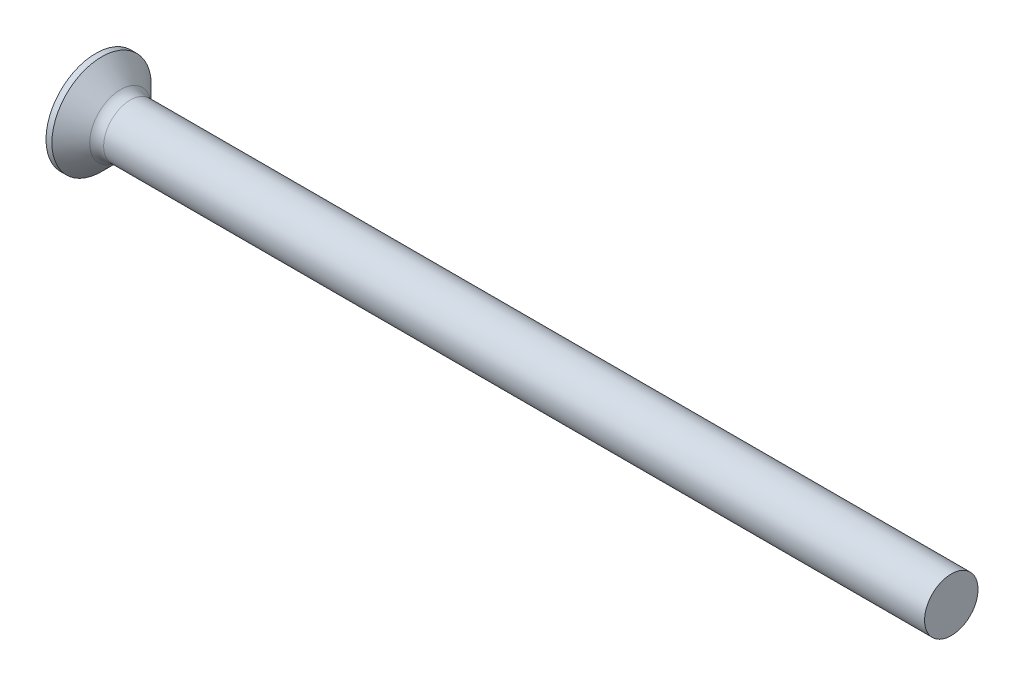
ISO-10303-21;
HEADER;
FILE_DESCRIPTION(('STEP AP214'),'2;1');
FILE_NAME('part.step','',(''),(''),'','','');
FILE_SCHEMA(('AUTOMOTIVE_DESIGN { 1 0 10303 214 1 1 1 1 }'));
ENDSEC;
DATA;
#1=APPLICATION_CONTEXT('core data for automotive mechanical design processes');
#2=APPLICATION_PROTOCOL_DEFINITION('international standard','automotive_design',2000,#1);
#3=PRODUCT_CONTEXT('',#1,'mechanical');
#4=PRODUCT('Part','Part','',(#3));
#5=PRODUCT_RELATED_PRODUCT_CATEGORY('part','',(#4));
#6=PRODUCT_DEFINITION_FORMATION('','',#4);
#7=PRODUCT_DEFINITION_CONTEXT('part definition',#1,'design');
#8=PRODUCT_DEFINITION('design','',#6,#7);
#9=PRODUCT_DEFINITION_SHAPE('','',#8);
#10=(LENGTH_UNIT() NAMED_UNIT(*) SI_UNIT(.MILLI.,.METRE.));
#11=(NAMED_UNIT(*) PLANE_ANGLE_UNIT() SI_UNIT($,.RADIAN.));
#12=(NAMED_UNIT(*) SI_UNIT($,.STERADIAN.) SOLID_ANGLE_UNIT());
#13=UNCERTAINTY_MEASURE_WITH_UNIT(LENGTH_MEASURE(1.E-05),#10,'distance_accuracy_value','');
#14=(GEOMETRIC_REPRESENTATION_CONTEXT(3) GLOBAL_UNCERTAINTY_ASSIGNED_CONTEXT((#13)) GLOBAL_UNIT_ASSIGNED_CONTEXT((#10,
#11,#12)) REPRESENTATION_CONTEXT('',''));
#15=CARTESIAN_POINT('',(0.,0.,0.));
#16=DIRECTION('',(0.,0.,1.));
#17=DIRECTION('',(1.,0.,0.));
#18=AXIS2_PLACEMENT_3D('',#15,#16,#17);
#19=CARTESIAN_POINT('',(3.05,-0.929326349741566,0.515));
#20=DIRECTION('',(0.,0.,-1.));
#21=DIRECTION('',(0.,1.,0.));
#22=AXIS2_PLACEMENT_3D('',#19,#20,#21);
#23=PLANE('',#22);
#24=DIRECTION('',(0.,-1.,0.));
#25=VECTOR('',#24,1.);
#26=CARTESIAN_POINT('',(0.,2.45,0.515));
#27=LINE('',#26,#25);
#28=CARTESIAN_POINT('',(0.,-0.931375357653026,0.515));
#29=VERTEX_POINT('',#28);
#30=CARTESIAN_POINT('',(0.,-2.45,0.515));
#31=VERTEX_POINT('',#30);
#32=EDGE_CURVE('E305',#29,#31,#27,.T.);
#33=ORIENTED_EDGE('',*,*,#32,.F.);
#34=CARTESIAN_POINT('',(-1.54221347305349,-1.05291860734043,0.515));
#35=CARTESIAN_POINT('',(-1.22007147016316,-1.02783607001973,0.515));
#36=CARTESIAN_POINT('',(-0.89794181675164,-1.002592893973,0.515));
#37=CARTESIAN_POINT('',(-0.253713842852045,-0.951673528807875,0.515));
#38=CARTESIAN_POINT('',(0.0683844773279263,-0.925997335794192,0.515));
#39=CARTESIAN_POINT('',(0.712537341146251,-0.874100649412191,0.515));
#40=CARTESIAN_POINT('',(1.03459188478602,-0.847880156061489,0.515));
#41=CARTESIAN_POINT('',(1.67864013954242,-0.794723210967585,0.515));
#42=CARTESIAN_POINT('',(2.0006338510091,-0.767786763479055,0.515));
#43=CARTESIAN_POINT('',(2.56056239677504,-0.720091607539808,0.515));
#44=CARTESIAN_POINT('',(2.7985160340986,-0.699554136185312,0.515));
#45=CARTESIAN_POINT('',(3.27436149939217,-0.657782810112313,0.515));
#46=CARTESIAN_POINT('',(3.51225332755344,-0.636548957574876,0.515));
#47=CARTESIAN_POINT('',(3.98796007755392,-0.59316517097504,0.515));
#48=CARTESIAN_POINT('',(4.22577499737104,-0.571015214531953,0.515));
#49=CARTESIAN_POINT('',(4.70127802763926,-0.525368927832394,0.515));
#50=CARTESIAN_POINT('',(4.93896613655203,-0.50187258160175,0.515000000000001));
#51=CARTESIAN_POINT('',(5.17656597464715,-0.477487906778811,0.515));
#52=B_SPLINE_CURVE_WITH_KNOTS('',3,(#34,#35,#36,#37,#38,#39,#40,#41,#42,#43,#44,#45,#46,#47,#48,
#49,#50,#51),.UNSPECIFIED.,.F.,.F.,(4,2,2,2,2,2,2,2,4),(0.,0.9693512359483,1.9387111965537,
2.90807112578744,3.87742529573196,4.59393929763426,5.3104510556289,6.0269803285681,
6.74351810449256),.UNSPECIFIED.);
#53=CARTESIAN_POINT('',(3.05,-0.677477674908921,0.515));
#54=VERTEX_POINT('',#53);
#55=EDGE_CURVE('E191',#29,#54,#52,.T.);
#56=ORIENTED_EDGE('',*,*,#55,.T.);
#57=DIRECTION('',(0.,-1.,0.));
#58=VECTOR('',#57,1.);
#59=CARTESIAN_POINT('',(3.05,0.929326349741566,0.515));
#60=LINE('',#59,#58);
#61=CARTESIAN_POINT('',(3.05,-0.929326349741566,0.515));
#62=VERTEX_POINT('',#61);
#63=EDGE_CURVE('E329',#54,#62,#60,.T.);
#64=ORIENTED_EDGE('',*,*,#63,.T.);
#65=DIRECTION('',(0.894934391398443,0.446197753347436,0.));
#66=VECTOR('',#65,1.);
#67=CARTESIAN_POINT('',(0.,-2.45,0.515));
#68=LINE('',#67,#66);
#69=EDGE_CURVE('E316',#31,#62,#68,.T.);
#70=ORIENTED_EDGE('',*,*,#69,.F.);
#71=EDGE_LOOP('',(#33,#56,#64,#70));
#72=FACE_BOUND('',#71,.T.);
#73=ADVANCED_FACE('F35',(#72),#23,.T.);
#74=CARTESIAN_POINT('',(3.05,0.929326349741566,0.515));
#75=VERTEX_POINT('',#74);
#76=CARTESIAN_POINT('',(3.05,0.677477674908922,0.515));
#77=VERTEX_POINT('',#76);
#78=EDGE_CURVE('E331',#75,#77,#60,.T.);
#79=ORIENTED_EDGE('',*,*,#78,.T.);
#80=CARTESIAN_POINT('',(-1.54221347305349,1.05291860734043,0.515));
#81=CARTESIAN_POINT('',(-1.22007147016316,1.02783607001973,0.515));
#82=CARTESIAN_POINT('',(-0.897941816751639,1.002592893973,0.515));
#83=CARTESIAN_POINT('',(-0.253713842852044,0.951673528807875,0.515));
#84=CARTESIAN_POINT('',(0.0683844773279269,0.925997335794192,0.515));
#85=CARTESIAN_POINT('',(0.712537341146252,0.874100649412191,0.515));
#86=CARTESIAN_POINT('',(1.03459188478602,0.847880156061489,0.515));
#87=CARTESIAN_POINT('',(1.67864013954242,0.794723210967585,0.515));
#88=CARTESIAN_POINT('',(2.0006338510091,0.767786763479056,0.515));
#89=CARTESIAN_POINT('',(2.56056239677504,0.720091607539808,0.515));
#90=CARTESIAN_POINT('',(2.7985160340986,0.699554136185312,0.515));
#91=CARTESIAN_POINT('',(3.27436149939217,0.657782810112313,0.515));
#92=CARTESIAN_POINT('',(3.51225332755343,0.636548957574876,0.515));
#93=CARTESIAN_POINT('',(3.98796007755392,0.59316517097504,0.515));
#94=CARTESIAN_POINT('',(4.22577499737104,0.571015214531953,0.515));
#95=CARTESIAN_POINT('',(4.70127802763926,0.525368927832394,0.515));
#96=CARTESIAN_POINT('',(4.93896613655203,0.50187258160175,0.515));
#97=CARTESIAN_POINT('',(5.17656597464715,0.477487906778811,0.515));
#98=B_SPLINE_CURVE_WITH_KNOTS('',3,(#80,#81,#82,#83,#84,#85,#86,#87,#88,#89,#90,#91,#92,#93,#94,
#95,#96,#97),.UNSPECIFIED.,.F.,.F.,(4,2,2,2,2,2,2,2,4),(0.,0.9693512359483,1.9387111965537,
2.90807112578744,3.87742529573196,4.59393929763426,5.3104510556289,6.0269803285681,
6.74351810449256),.UNSPECIFIED.);
#99=CARTESIAN_POINT('',(0.,0.931375357653026,0.515));
#100=VERTEX_POINT('',#99);
#101=EDGE_CURVE('E185',#77,#100,#98,.F.);
#102=ORIENTED_EDGE('',*,*,#101,.T.);
#103=CARTESIAN_POINT('',(0.,2.45,0.515));
#104=VERTEX_POINT('',#103);
#105=EDGE_CURVE('E307',#104,#100,#27,.T.);
#106=ORIENTED_EDGE('',*,*,#105,.F.);
#107=DIRECTION('',(0.894934391398443,-0.446197753347436,0.));
#108=VECTOR('',#107,1.);
#109=CARTESIAN_POINT('',(0.,2.45,0.515));
#110=LINE('',#109,#108);
#111=EDGE_CURVE('E63',#104,#75,#110,.T.);
#112=ORIENTED_EDGE('',*,*,#111,.T.);
#113=EDGE_LOOP('',(#79,#102,#106,#112));
#114=FACE_BOUND('',#113,.T.);
#115=ADVANCED_FACE('F167',(#114),#23,.T.);
#116=CARTESIAN_POINT('',(3.05,0.929326349741566,-0.515));
#117=DIRECTION('',(0.,0.,1.));
#118=DIRECTION('',(1.,0.,0.));
#119=AXIS2_PLACEMENT_3D('',#116,#117,#118);
#120=PLANE('',#119);
#121=DIRECTION('',(0.,1.,0.));
#122=VECTOR('',#121,1.);
#123=CARTESIAN_POINT('',(3.05,-0.929326349741566,-0.515));
#124=LINE('',#123,#122);
#125=CARTESIAN_POINT('',(3.05,-0.929326349741566,-0.515));
#126=VERTEX_POINT('',#125);
#127=CARTESIAN_POINT('',(3.05,-0.677477674908921,-0.515));
#128=VERTEX_POINT('',#127);
#129=EDGE_CURVE('E330',#126,#128,#124,.T.);
#130=ORIENTED_EDGE('',*,*,#129,.T.);
#131=CARTESIAN_POINT('',(-1.54221347058903,-1.05291860714859,-0.515));
#132=CARTESIAN_POINT('',(-1.22007146800241,-1.02783606985067,-0.515));
#133=CARTESIAN_POINT('',(-0.897941814894598,-1.00259289382691,-0.515));
#134=CARTESIAN_POINT('',(-0.253713841602368,-0.951673528708394,-0.515));
#135=CARTESIAN_POINT('',(0.0683844782739386,-0.925997335718344,-0.515));
#136=CARTESIAN_POINT('',(0.712537341258934,-0.874100649402746,-0.515));
#137=CARTESIAN_POINT('',(1.03459188436907,-0.847880156095195,-0.515));
#138=CARTESIAN_POINT('',(1.67864013806642,-0.794723211090118,-0.515));
#139=CARTESIAN_POINT('',(2.00063384900369,-0.767786763647265,-0.515));
#140=CARTESIAN_POINT('',(2.56056239424054,-0.720091607757628,-0.515));
#141=CARTESIAN_POINT('',(2.79851603156427,-0.699554136405274,-0.515));
#142=CARTESIAN_POINT('',(3.27436149685826,-0.657782810337244,-0.515));
#143=CARTESIAN_POINT('',(3.51225332501977,-0.636548957802634,-0.515));
#144=CARTESIAN_POINT('',(3.98796007502083,-0.593165171209448,-0.515));
#145=CARTESIAN_POINT('',(4.22577499483828,-0.571015214770186,-0.515));
#146=CARTESIAN_POINT('',(4.70127802510735,-0.525368928080088,-0.515));
#147=CARTESIAN_POINT('',(4.93896613402064,-0.501872581855082,-0.515));
#148=CARTESIAN_POINT('',(5.17656597211643,-0.477487907039094,-0.515));
#149=B_SPLINE_CURVE_WITH_KNOTS('',3,(#131,#132,#133,#134,#135,#136,#137,#138,#139,#140,#141,
#142,#143,#144,#145,#146,#147,#148),.UNSPECIFIED.,.F.,.F.,(4,2,2,2,2,2,2,2,4),(0.,
0.9693512350346,1.93871119472626,2.90807112236582,3.87742529071622,4.59393929261848,
5.3104510506131,6.02698032355223,6.74351809947659),.UNSPECIFIED.);
#150=CARTESIAN_POINT('',(0.,-0.931375357653026,-0.515));
#151=VERTEX_POINT('',#150);
#152=EDGE_CURVE('E232',#128,#151,#149,.F.);
#153=ORIENTED_EDGE('',*,*,#152,.T.);
#154=DIRECTION('',(0.,1.,0.));
#155=VECTOR('',#154,1.);
#156=CARTESIAN_POINT('',(0.,-2.45,-0.515));
#157=LINE('',#156,#155);
#158=CARTESIAN_POINT('',(0.,-2.45,-0.515));
#159=VERTEX_POINT('',#158);
#160=EDGE_CURVE('E306',#159,#151,#157,.T.);
#161=ORIENTED_EDGE('',*,*,#160,.F.);
#162=DIRECTION('',(0.894934391398443,0.446197753347436,0.));
#163=VECTOR('',#162,1.);
#164=CARTESIAN_POINT('',(0.,-2.45,-0.515));
#165=LINE('',#164,#163);
#166=EDGE_CURVE('E319',#159,#126,#165,.T.);
#167=ORIENTED_EDGE('',*,*,#166,.T.);
#168=EDGE_LOOP('',(#130,#153,#161,#167));
#169=FACE_BOUND('',#168,.T.);
#170=ADVANCED_FACE('F173',(#169),#120,.T.);
#171=CARTESIAN_POINT('',(0.,0.931375357653026,-0.515));
#172=VERTEX_POINT('',#171);
#173=CARTESIAN_POINT('',(0.,2.45,-0.515));
#174=VERTEX_POINT('',#173);
#175=EDGE_CURVE('E315',#172,#174,#157,.T.);
#176=ORIENTED_EDGE('',*,*,#175,.F.);
#177=CARTESIAN_POINT('',(-1.54221347058903,1.05291860714859,-0.515));
#178=CARTESIAN_POINT('',(-1.22007146800241,1.02783606985067,-0.515));
#179=CARTESIAN_POINT('',(-0.897941814894598,1.00259289382691,-0.515));
#180=CARTESIAN_POINT('',(-0.253713841602368,0.951673528708394,-0.515));
#181=CARTESIAN_POINT('',(0.0683844782739387,0.925997335718344,-0.515));
#182=CARTESIAN_POINT('',(0.712537341258934,0.874100649402746,-0.515));
#183=CARTESIAN_POINT('',(1.03459188436907,0.847880156095195,-0.515));
#184=CARTESIAN_POINT('',(1.67864013806642,0.794723211090118,-0.515));
#185=CARTESIAN_POINT('',(2.00063384900369,0.767786763647266,-0.515));
#186=CARTESIAN_POINT('',(2.56056239424054,0.720091607757628,-0.515));
#187=CARTESIAN_POINT('',(2.79851603156427,0.699554136405274,-0.515));
#188=CARTESIAN_POINT('',(3.27436149685826,0.657782810337244,-0.515));
#189=CARTESIAN_POINT('',(3.51225332501977,0.636548957802634,-0.515));
#190=CARTESIAN_POINT('',(3.98796007502083,0.593165171209449,-0.515));
#191=CARTESIAN_POINT('',(4.22577499483827,0.571015214770186,-0.515));
#192=CARTESIAN_POINT('',(4.70127802510734,0.525368928080088,-0.515));
#193=CARTESIAN_POINT('',(4.93896613402064,0.501872581855082,-0.515));
#194=CARTESIAN_POINT('',(5.17656597211643,0.477487907039094,-0.515));
#195=B_SPLINE_CURVE_WITH_KNOTS('',3,(#177,#178,#179,#180,#181,#182,#183,#184,#185,#186,#187,
#188,#189,#190,#191,#192,#193,#194),.UNSPECIFIED.,.F.,.F.,(4,2,2,2,2,2,2,2,4),(0.,
0.9693512350346,1.93871119472626,2.90807112236582,3.87742529071622,4.59393929261848,
5.3104510506131,6.02698032355223,6.74351809947659),.UNSPECIFIED.);
#196=CARTESIAN_POINT('',(3.05,0.677477674908921,-0.515));
#197=VERTEX_POINT('',#196);
#198=EDGE_CURVE('E228',#172,#197,#195,.T.);
#199=ORIENTED_EDGE('',*,*,#198,.T.);
#200=CARTESIAN_POINT('',(3.05,0.929326349741566,-0.515));
#201=VERTEX_POINT('',#200);
#202=EDGE_CURVE('E336',#197,#201,#124,.T.);
#203=ORIENTED_EDGE('',*,*,#202,.T.);
#204=DIRECTION('',(0.894934391398443,-0.446197753347436,0.));
#205=VECTOR('',#204,1.);
#206=CARTESIAN_POINT('',(0.,2.45,-0.515));
#207=LINE('',#206,#205);
#208=EDGE_CURVE('E323',#174,#201,#207,.T.);
#209=ORIENTED_EDGE('',*,*,#208,.F.);
#210=EDGE_LOOP('',(#176,#199,#203,#209));
#211=FACE_BOUND('',#210,.T.);
#212=ADVANCED_FACE('F452',(#211),#120,.T.);
#213=CARTESIAN_POINT('',(3.05,0.929326349741566,-0.515));
#214=DIRECTION('',(1.,0.,0.));
#215=DIRECTION('',(0.,0.,-1.));
#216=AXIS2_PLACEMENT_3D('',#213,#214,#215);
#217=PLANE('',#216);
#218=CARTESIAN_POINT('',(3.05,0.,0.));
#219=DIRECTION('',(-1.,0.,0.));
#220=DIRECTION('',(0.,0.,1.));
#221=AXIS2_PLACEMENT_3D('',#218,#219,#220);
#222=CIRCLE('',#221,0.850999999999999);
#223=EDGE_CURVE('E275',#128,#54,#222,.T.);
#224=ORIENTED_EDGE('',*,*,#223,.F.);
#225=ORIENTED_EDGE('',*,*,#129,.F.);
#226=DIRECTION('',(0.,0.,-1.));
#227=VECTOR('',#226,1.);
#228=CARTESIAN_POINT('',(3.05,-0.929326349741566,0.515));
#229=LINE('',#228,#227);
#230=EDGE_CURVE('E326',#62,#126,#229,.T.);
#231=ORIENTED_EDGE('',*,*,#230,.F.);
#232=ORIENTED_EDGE('',*,*,#63,.F.);
#233=EDGE_LOOP('',(#224,#225,#231,#232));
#234=FACE_BOUND('',#233,.T.);
#235=ADVANCED_FACE('F409',(#234),#217,.F.);
#236=CARTESIAN_POINT('',(3.05,-0.515000000000003,0.67747767490892));
#237=VERTEX_POINT('',#236);
#238=CARTESIAN_POINT('',(3.05,0.514999999999998,0.677477674908923));
#239=VERTEX_POINT('',#238);
#240=EDGE_CURVE('E268',#237,#239,#222,.T.);
#241=ORIENTED_EDGE('',*,*,#240,.F.);
#242=DIRECTION('',(0.,0.,-1.));
#243=VECTOR('',#242,1.);
#244=CARTESIAN_POINT('',(3.05,-0.515000000000003,0.929326349741565));
#245=LINE('',#244,#243);
#246=CARTESIAN_POINT('',(3.05,-0.515000000000003,0.929326349741564));
#247=VERTEX_POINT('',#246);
#248=EDGE_CURVE('E394',#247,#237,#245,.T.);
#249=ORIENTED_EDGE('',*,*,#248,.F.);
#250=DIRECTION('',(0.,-1.,0.));
#251=VECTOR('',#250,1.);
#252=CARTESIAN_POINT('',(3.05,0.514999999999997,0.929326349741568));
#253=LINE('',#252,#251);
#254=CARTESIAN_POINT('',(3.05,0.514999999999997,0.929326349741568));
#255=VERTEX_POINT('',#254);
#256=EDGE_CURVE('E294',#255,#247,#253,.T.);
#257=ORIENTED_EDGE('',*,*,#256,.F.);
#258=DIRECTION('',(0.,0.,1.));
#259=VECTOR('',#258,1.);
#260=CARTESIAN_POINT('',(3.05,0.515000000000003,-0.929326349741564));
#261=LINE('',#260,#259);
#262=EDGE_CURVE('E197',#239,#255,#261,.T.);
#263=ORIENTED_EDGE('',*,*,#262,.F.);
#264=EDGE_LOOP('',(#241,#249,#257,#263));
#265=FACE_BOUND('',#264,.T.);
#266=ADVANCED_FACE('F444',(#265),#217,.F.);
#267=EDGE_CURVE('E267',#77,#197,#222,.T.);
#268=ORIENTED_EDGE('',*,*,#267,.F.);
#269=ORIENTED_EDGE('',*,*,#78,.F.);
#270=DIRECTION('',(0.,0.,1.));
#271=VECTOR('',#270,1.);
#272=CARTESIAN_POINT('',(3.05,0.929326349741566,-0.515));
#273=LINE('',#272,#271);
#274=EDGE_CURVE('E327',#201,#75,#273,.T.);
#275=ORIENTED_EDGE('',*,*,#274,.F.);
#276=ORIENTED_EDGE('',*,*,#202,.F.);
#277=EDGE_LOOP('',(#268,#269,#275,#276));
#278=FACE_BOUND('',#277,.T.);
#279=ADVANCED_FACE('F424',(#278),#217,.F.);
#280=CARTESIAN_POINT('',(3.05,0.514999999999997,0.929326349741568));
#281=DIRECTION('',(0.,-1.,0.));
#282=DIRECTION('',(1.,0.,0.));
#283=AXIS2_PLACEMENT_3D('',#280,#281,#282);
#284=PLANE('',#283);
#285=CARTESIAN_POINT('',(3.05,0.515000000000003,-0.929326349741564));
#286=VERTEX_POINT('',#285);
#287=CARTESIAN_POINT('',(3.05,0.515000000000002,-0.67747767490892));
#288=VERTEX_POINT('',#287);
#289=EDGE_CURVE('E289',#286,#288,#261,.T.);
#290=ORIENTED_EDGE('',*,*,#289,.T.);
#291=CARTESIAN_POINT('',(-1.54221347305349,0.515000000000004,-1.05291860734043));
#292=CARTESIAN_POINT('',(-1.22007147016316,0.515000000000003,-1.02783607001973));
#293=CARTESIAN_POINT('',(-0.89794181675164,0.515000000000003,-1.002592893973));
#294=CARTESIAN_POINT('',(-0.253713842852045,0.515000000000003,-0.951673528807873));
#295=CARTESIAN_POINT('',(0.0683844773279265,0.515000000000003,-0.92599733579419));
#296=CARTESIAN_POINT('',(0.712537341146251,0.515000000000003,-0.87410064941219));
#297=CARTESIAN_POINT('',(1.03459188478602,0.515000000000003,-0.847880156061487));
#298=CARTESIAN_POINT('',(1.67864013954242,0.515000000000003,-0.794723210967583));
#299=CARTESIAN_POINT('',(2.0006338510091,0.515000000000003,-0.767786763479054));
#300=CARTESIAN_POINT('',(2.56056239677504,0.515000000000003,-0.720091607539807));
#301=CARTESIAN_POINT('',(2.7985160340986,0.515000000000003,-0.69955413618531));
#302=CARTESIAN_POINT('',(3.27436149939217,0.515000000000003,-0.657782810112311));
#303=CARTESIAN_POINT('',(3.51225332755343,0.515000000000002,-0.636548957574874));
#304=CARTESIAN_POINT('',(3.98796007755392,0.515000000000002,-0.593165170975038));
#305=CARTESIAN_POINT('',(4.22577499737104,0.515000000000002,-0.571015214531951));
#306=CARTESIAN_POINT('',(4.70127802763926,0.515000000000002,-0.525368927832392));
#307=CARTESIAN_POINT('',(4.93896613655203,0.515000000000002,-0.501872581601748));
#308=CARTESIAN_POINT('',(5.17656597464715,0.515000000000002,-0.47748790677881));
#309=B_SPLINE_CURVE_WITH_KNOTS('',3,(#291,#292,#293,#294,#295,#296,#297,#298,#299,#300,#301,
#302,#303,#304,#305,#306,#307,#308),.UNSPECIFIED.,.F.,.F.,(4,2,2,2,2,2,2,2,4),(0.,
0.9693512359483,1.9387111965537,2.90807112578744,3.87742529573196,4.59393929763426,
5.3104510556289,6.0269803285681,6.74351810449256),.UNSPECIFIED.);
#310=CARTESIAN_POINT('',(0.,0.515000000000003,-0.931375357653024));
#311=VERTEX_POINT('',#310);
#312=EDGE_CURVE('E222',#288,#311,#309,.F.);
#313=ORIENTED_EDGE('',*,*,#312,.T.);
#314=DIRECTION('',(0.,0.,1.));
#315=VECTOR('',#314,1.);
#316=CARTESIAN_POINT('',(0.,0.515000000000008,-2.45));
#317=LINE('',#316,#315);
#318=CARTESIAN_POINT('',(0.,0.515000000000008,-2.45));
#319=VERTEX_POINT('',#318);
#320=EDGE_CURVE('E383',#319,#311,#317,.T.);
#321=ORIENTED_EDGE('',*,*,#320,.F.);
#322=DIRECTION('',(0.894934391398443,0.,0.446197753347436));
#323=VECTOR('',#322,1.);
#324=CARTESIAN_POINT('',(0.,0.515000000000008,-2.45));
#325=LINE('',#324,#323);
#326=EDGE_CURVE('E293',#319,#286,#325,.T.);
#327=ORIENTED_EDGE('',*,*,#326,.T.);
#328=EDGE_LOOP('',(#290,#313,#321,#327));
#329=FACE_BOUND('',#328,.T.);
#330=ADVANCED_FACE('F292',(#329),#284,.T.);
#331=CARTESIAN_POINT('',(3.05,-0.514999999999997,-0.929326349741568));
#332=DIRECTION('',(0.,1.,0.));
#333=DIRECTION('',(0.,0.,1.));
#334=AXIS2_PLACEMENT_3D('',#331,#332,#333);
#335=PLANE('',#334);
#336=DIRECTION('',(0.,0.,-1.));
#337=VECTOR('',#336,1.);
#338=CARTESIAN_POINT('',(0.,-0.515000000000008,2.45));
#339=LINE('',#338,#337);
#340=CARTESIAN_POINT('',(0.,-0.514999999999997,-0.931375357653028));
#341=VERTEX_POINT('',#340);
#342=CARTESIAN_POINT('',(0.,-0.514999999999992,-2.45));
#343=VERTEX_POINT('',#342);
#344=EDGE_CURVE('E379',#341,#343,#339,.T.);
#345=ORIENTED_EDGE('',*,*,#344,.F.);
#346=CARTESIAN_POINT('',(-1.54221347305349,-0.514999999999996,-1.05291860734043));
#347=CARTESIAN_POINT('',(-1.22007147016316,-0.514999999999996,-1.02783607001974));
#348=CARTESIAN_POINT('',(-0.897941816751639,-0.514999999999996,-1.002592893973));
#349=CARTESIAN_POINT('',(-0.253713842852044,-0.514999999999997,-0.951673528807876));
#350=CARTESIAN_POINT('',(0.0683844773279269,-0.514999999999997,-0.925997335794194));
#351=CARTESIAN_POINT('',(0.712537341146252,-0.514999999999997,-0.874100649412193));
#352=CARTESIAN_POINT('',(1.03459188478602,-0.514999999999997,-0.847880156061491));
#353=CARTESIAN_POINT('',(1.67864013954242,-0.514999999999997,-0.794723210967587));
#354=CARTESIAN_POINT('',(2.0006338510091,-0.514999999999998,-0.767786763479057));
#355=CARTESIAN_POINT('',(2.56056239677504,-0.514999999999998,-0.72009160753981));
#356=CARTESIAN_POINT('',(2.7985160340986,-0.514999999999998,-0.699554136185314));
#357=CARTESIAN_POINT('',(3.27436149939217,-0.514999999999998,-0.657782810112314));
#358=CARTESIAN_POINT('',(3.51225332755343,-0.514999999999998,-0.636548957574878));
#359=CARTESIAN_POINT('',(3.98796007755392,-0.514999999999998,-0.593165170975042));
#360=CARTESIAN_POINT('',(4.22577499737104,-0.514999999999998,-0.571015214531954));
#361=CARTESIAN_POINT('',(4.70127802763926,-0.514999999999999,-0.525368927832395));
#362=CARTESIAN_POINT('',(4.93896613655203,-0.514999999999999,-0.501872581601752));
#363=CARTESIAN_POINT('',(5.17656597464715,-0.514999999999999,-0.477487906778813));
#364=B_SPLINE_CURVE_WITH_KNOTS('',3,(#346,#347,#348,#349,#350,#351,#352,#353,#354,#355,#356,
#357,#358,#359,#360,#361,#362,#363),.UNSPECIFIED.,.F.,.F.,(4,2,2,2,2,2,2,2,4),(0.,
0.9693512359483,1.9387111965537,2.90807112578744,3.87742529573196,4.59393929763426,
5.3104510556289,6.0269803285681,6.74351810449256),.UNSPECIFIED.);
#365=CARTESIAN_POINT('',(3.05,-0.514999999999998,-0.677477674908923));
#366=VERTEX_POINT('',#365);
#367=EDGE_CURVE('E216',#341,#366,#364,.T.);
#368=ORIENTED_EDGE('',*,*,#367,.T.);
#369=CARTESIAN_POINT('',(3.05,-0.514999999999997,-0.929326349741568));
#370=VERTEX_POINT('',#369);
#371=EDGE_CURVE('E291',#366,#370,#245,.T.);
#372=ORIENTED_EDGE('',*,*,#371,.T.);
#373=DIRECTION('',(0.894934391398443,0.,0.446197753347436));
#374=VECTOR('',#373,1.);
#375=CARTESIAN_POINT('',(0.,-0.514999999999992,-2.45));
#376=LINE('',#375,#374);
#377=EDGE_CURVE('E386',#343,#370,#376,.T.);
#378=ORIENTED_EDGE('',*,*,#377,.F.);
#379=EDGE_LOOP('',(#345,#368,#372,#378));
#380=FACE_BOUND('',#379,.T.);
#381=ADVANCED_FACE('F397',(#380),#335,.T.);
#382=ORIENTED_EDGE('',*,*,#248,.T.);
#383=CARTESIAN_POINT('',(-1.54221347305349,-0.515000000000003,1.05291860734043));
#384=CARTESIAN_POINT('',(-1.22007147016316,-0.515000000000003,1.02783607001973));
#385=CARTESIAN_POINT('',(-0.89794181675164,-0.515000000000003,1.002592893973));
#386=CARTESIAN_POINT('',(-0.253713842852045,-0.515000000000003,0.951673528807873));
#387=CARTESIAN_POINT('',(0.0683844773279265,-0.515000000000003,0.92599733579419));
#388=CARTESIAN_POINT('',(0.712537341146251,-0.515000000000003,0.87410064941219));
#389=CARTESIAN_POINT('',(1.03459188478602,-0.515000000000003,0.847880156061487));
#390=CARTESIAN_POINT('',(1.67864013954242,-0.515000000000003,0.794723210967583));
#391=CARTESIAN_POINT('',(2.0006338510091,-0.515000000000003,0.767786763479054));
#392=CARTESIAN_POINT('',(2.56056239677504,-0.515000000000003,0.720091607539807));
#393=CARTESIAN_POINT('',(2.7985160340986,-0.515000000000003,0.69955413618531));
#394=CARTESIAN_POINT('',(3.27436149939217,-0.515000000000003,0.657782810112311));
#395=CARTESIAN_POINT('',(3.51225332755343,-0.515000000000003,0.636548957574874));
#396=CARTESIAN_POINT('',(3.98796007755392,-0.515000000000002,0.593165170975038));
#397=CARTESIAN_POINT('',(4.22577499737104,-0.515000000000002,0.571015214531951));
#398=CARTESIAN_POINT('',(4.70127802763926,-0.515000000000002,0.525368927832392));
#399=CARTESIAN_POINT('',(4.93896613655203,-0.515000000000002,0.501872581601748));
#400=CARTESIAN_POINT('',(5.17656597464715,-0.515000000000002,0.47748790677881));
#401=B_SPLINE_CURVE_WITH_KNOTS('',3,(#383,#384,#385,#386,#387,#388,#389,#390,#391,#392,#393,
#394,#395,#396,#397,#398,#399,#400),.UNSPECIFIED.,.F.,.F.,(4,2,2,2,2,2,2,2,4),(0.,
0.9693512359483,1.9387111965537,2.90807112578744,3.87742529573196,4.59393929763426,
5.3104510556289,6.0269803285681,6.74351810449256),.UNSPECIFIED.);
#402=CARTESIAN_POINT('',(0.,-0.515000000000003,0.931375357653024));
#403=VERTEX_POINT('',#402);
#404=EDGE_CURVE('E209',#237,#403,#401,.F.);
#405=ORIENTED_EDGE('',*,*,#404,.T.);
#406=CARTESIAN_POINT('',(0.,-0.515000000000008,2.45));
#407=VERTEX_POINT('',#406);
#408=EDGE_CURVE('E375',#407,#403,#339,.T.);
#409=ORIENTED_EDGE('',*,*,#408,.F.);
#410=DIRECTION('',(0.894934391398443,0.,-0.446197753347436));
#411=VECTOR('',#410,1.);
#412=CARTESIAN_POINT('',(0.,-0.515000000000008,2.45));
#413=LINE('',#412,#411);
#414=EDGE_CURVE('E390',#407,#247,#413,.T.);
#415=ORIENTED_EDGE('',*,*,#414,.T.);
#416=EDGE_LOOP('',(#382,#405,#409,#415));
#417=FACE_BOUND('',#416,.T.);
#418=ADVANCED_FACE('F428',(#417),#335,.T.);
#419=CARTESIAN_POINT('',(0.,0.514999999999997,0.931375357653028));
#420=VERTEX_POINT('',#419);
#421=CARTESIAN_POINT('',(0.,0.514999999999991,2.45));
#422=VERTEX_POINT('',#421);
#423=EDGE_CURVE('E385',#420,#422,#317,.T.);
#424=ORIENTED_EDGE('',*,*,#423,.F.);
#425=CARTESIAN_POINT('',(-1.54221347058903,0.514999999999996,1.05291860714859));
#426=CARTESIAN_POINT('',(-1.22007146800241,0.514999999999996,1.02783606985067));
#427=CARTESIAN_POINT('',(-0.897941814894598,0.514999999999996,1.00259289382691));
#428=CARTESIAN_POINT('',(-0.253713841602368,0.514999999999996,0.951673528708396));
#429=CARTESIAN_POINT('',(0.0683844782739386,0.514999999999997,0.925997335718346));
#430=CARTESIAN_POINT('',(0.712537341258934,0.514999999999997,0.874100649402748));
#431=CARTESIAN_POINT('',(1.03459188436907,0.514999999999997,0.847880156095197));
#432=CARTESIAN_POINT('',(1.67864013806642,0.514999999999997,0.79472321109012));
#433=CARTESIAN_POINT('',(2.00063384900369,0.514999999999997,0.767786763647267));
#434=CARTESIAN_POINT('',(2.56056239424054,0.514999999999998,0.72009160775763));
#435=CARTESIAN_POINT('',(2.79851603156427,0.514999999999998,0.699554136405276));
#436=CARTESIAN_POINT('',(3.27436149685826,0.514999999999998,0.657782810337246));
#437=CARTESIAN_POINT('',(3.51225332501977,0.514999999999998,0.636548957802636));
#438=CARTESIAN_POINT('',(3.98796007502083,0.514999999999998,0.59316517120945));
#439=CARTESIAN_POINT('',(4.22577499483828,0.514999999999998,0.571015214770188));
#440=CARTESIAN_POINT('',(4.70127802510735,0.514999999999998,0.52536892808009));
#441=CARTESIAN_POINT('',(4.93896613402064,0.514999999999998,0.501872581855084));
#442=CARTESIAN_POINT('',(5.17656597211643,0.514999999999999,0.477487907039096));
#443=B_SPLINE_CURVE_WITH_KNOTS('',3,(#425,#426,#427,#428,#429,#430,#431,#432,#433,#434,#435,
#436,#437,#438,#439,#440,#441,#442),.UNSPECIFIED.,.F.,.F.,(4,2,2,2,2,2,2,2,4),(0.,
0.9693512350346,1.93871119472626,2.90807112236582,3.87742529071622,4.59393929261848,
5.3104510506131,6.02698032355223,6.74351809947659),.UNSPECIFIED.);
#444=EDGE_CURVE('E11',#420,#239,#443,.T.);
#445=ORIENTED_EDGE('',*,*,#444,.T.);
#446=ORIENTED_EDGE('',*,*,#262,.T.);
#447=DIRECTION('',(0.894934391398443,0.,-0.446197753347436));
#448=VECTOR('',#447,1.);
#449=CARTESIAN_POINT('',(0.,0.514999999999991,2.45));
#450=LINE('',#449,#448);
#451=EDGE_CURVE('E392',#422,#255,#450,.T.);
#452=ORIENTED_EDGE('',*,*,#451,.F.);
#453=EDGE_LOOP('',(#424,#445,#446,#452));
#454=FACE_BOUND('',#453,.T.);
#455=ADVANCED_FACE('F373',(#454),#284,.T.);
#456=CARTESIAN_POINT('',(0.,0.,0.));
#457=DIRECTION('',(-1.,0.,0.));
#458=DIRECTION('',(0.,0.,1.));
#459=AXIS2_PLACEMENT_3D('',#456,#457,#458);
#460=PLANE('',#459);
#461=CARTESIAN_POINT('',(0.,0.,0.));
#462=DIRECTION('',(-1.,0.,0.));
#463=DIRECTION('',(0.,0.,1.));
#464=AXIS2_PLACEMENT_3D('',#461,#462,#463);
#465=CIRCLE('',#464,4.65);
#466=CARTESIAN_POINT('',(0.,0.,4.65));
#467=VERTEX_POINT('',#466);
#468=EDGE_CURVE('E342',#467,#467,#465,.T.);
#469=ORIENTED_EDGE('',*,*,#468,.T.);
#470=EDGE_LOOP('',(#469));
#471=FACE_BOUND('',#470,.T.);
#472=ORIENTED_EDGE('',*,*,#408,.T.);
#473=CARTESIAN_POINT('',(0.,0.,0.));
#474=DIRECTION('',(-1.,0.,0.));
#475=DIRECTION('',(0.,0.,1.));
#476=AXIS2_PLACEMENT_3D('',#473,#474,#475);
#477=CIRCLE('',#476,1.06427677642768);
#478=EDGE_CURVE('E261',#29,#403,#477,.T.);
#479=ORIENTED_EDGE('',*,*,#478,.F.);
#480=ORIENTED_EDGE('',*,*,#32,.T.);
#481=DIRECTION('',(0.,0.,-1.));
#482=VECTOR('',#481,1.);
#483=CARTESIAN_POINT('',(0.,-2.45,0.515));
#484=LINE('',#483,#482);
#485=EDGE_CURVE('E310',#31,#159,#484,.T.);
#486=ORIENTED_EDGE('',*,*,#485,.T.);
#487=ORIENTED_EDGE('',*,*,#160,.T.);
#488=EDGE_CURVE('E263',#341,#151,#477,.T.);
#489=ORIENTED_EDGE('',*,*,#488,.F.);
#490=ORIENTED_EDGE('',*,*,#344,.T.);
#491=DIRECTION('',(0.,1.,0.));
#492=VECTOR('',#491,1.);
#493=CARTESIAN_POINT('',(0.,-0.514999999999992,-2.45));
#494=LINE('',#493,#492);
#495=EDGE_CURVE('E378',#343,#319,#494,.T.);
#496=ORIENTED_EDGE('',*,*,#495,.T.);
#497=ORIENTED_EDGE('',*,*,#320,.T.);
#498=EDGE_CURVE('E260',#172,#311,#477,.T.);
#499=ORIENTED_EDGE('',*,*,#498,.F.);
#500=ORIENTED_EDGE('',*,*,#175,.T.);
#501=DIRECTION('',(0.,0.,1.));
#502=VECTOR('',#501,1.);
#503=CARTESIAN_POINT('',(0.,2.45,-0.515));
#504=LINE('',#503,#502);
#505=EDGE_CURVE('E302',#174,#104,#504,.T.);
#506=ORIENTED_EDGE('',*,*,#505,.T.);
#507=ORIENTED_EDGE('',*,*,#105,.T.);
#508=EDGE_CURVE('E256',#420,#100,#477,.T.);
#509=ORIENTED_EDGE('',*,*,#508,.F.);
#510=ORIENTED_EDGE('',*,*,#423,.T.);
#511=DIRECTION('',(0.,-1.,0.));
#512=VECTOR('',#511,1.);
#513=CARTESIAN_POINT('',(0.,0.514999999999991,2.45));
#514=LINE('',#513,#512);
#515=EDGE_CURVE('E198',#422,#407,#514,.T.);
#516=ORIENTED_EDGE('',*,*,#515,.T.);
#517=EDGE_LOOP('',(#472,#479,#480,#486,#487,#489,#490,#496,#497,#499,#500,#506,#507,#509,#510,#516));
#518=FACE_BOUND('',#517,.T.);
#519=ADVANCED_FACE('F367',(#471,#518),#460,.T.);
#520=CARTESIAN_POINT('',(-6.34999999999999,0.,0.));
#521=DIRECTION('',(-1.,0.,0.));
#522=DIRECTION('',(0.,0.,1.));
#523=AXIS2_PLACEMENT_3D('',#520,#521,#522);
#524=CYLINDRICAL_SURFACE('',#523,4.65);
#525=CARTESIAN_POINT('',(0.550000000000009,0.,0.));
#526=DIRECTION('',(-1.,0.,0.));
#527=DIRECTION('',(0.,0.,1.));
#528=AXIS2_PLACEMENT_3D('',#525,#526,#527);
#529=CIRCLE('',#528,4.65);
#530=CARTESIAN_POINT('',(0.550000000000009,0.,4.65));
#531=VERTEX_POINT('',#530);
#532=EDGE_CURVE('E339',#531,#531,#529,.T.);
#533=ORIENTED_EDGE('',*,*,#532,.T.);
#534=EDGE_LOOP('',(#533));
#535=FACE_BOUND('',#534,.T.);
#536=ORIENTED_EDGE('',*,*,#468,.F.);
#537=EDGE_LOOP('',(#536));
#538=FACE_BOUND('',#537,.T.);
#539=ADVANCED_FACE('F361',(#535,#538),#524,.T.);
#540=CARTESIAN_POINT('',(0.550000000000009,0.,0.));
#541=DIRECTION('',(-1.,0.,0.));
#542=DIRECTION('',(0.,0.,1.));
#543=AXIS2_PLACEMENT_3D('',#540,#541,#542);
#544=CONICAL_SURFACE('',#543,4.65,0.78539816339745);
#545=CARTESIAN_POINT('',(2.31923881554251,0.,0.));
#546=DIRECTION('',(-1.,0.,0.));
#547=DIRECTION('',(0.,0.,1.));
#548=AXIS2_PLACEMENT_3D('',#545,#546,#547);
#549=CIRCLE('',#548,2.88076118445749);
#550=CARTESIAN_POINT('',(2.31923881554251,0.,2.88076118445749));
#551=VERTEX_POINT('',#550);
#552=EDGE_CURVE('E345',#551,#551,#549,.T.);
#553=ORIENTED_EDGE('',*,*,#552,.T.);
#554=EDGE_LOOP('',(#553));
#555=FACE_BOUND('',#554,.T.);
#556=ORIENTED_EDGE('',*,*,#532,.F.);
#557=EDGE_LOOP('',(#556));
#558=FACE_BOUND('',#557,.T.);
#559=ADVANCED_FACE('F358',(#555,#558),#544,.T.);
#560=CARTESIAN_POINT('',(-6.34999999999999,0.,0.));
#561=DIRECTION('',(-1.,0.,0.));
#562=DIRECTION('',(0.,0.,1.));
#563=AXIS2_PLACEMENT_3D('',#560,#561,#562);
#564=CYLINDRICAL_SURFACE('',#563,2.5);
#565=CARTESIAN_POINT('',(3.23847763108503,0.,0.));
#566=DIRECTION('',(-1.,0.,0.));
#567=DIRECTION('',(0.,0.,1.));
#568=AXIS2_PLACEMENT_3D('',#565,#566,#567);
#569=CIRCLE('',#568,2.5);
#570=CARTESIAN_POINT('',(3.23847763108503,0.,2.5));
#571=VERTEX_POINT('',#570);
#572=EDGE_CURVE('E48',#571,#571,#569,.F.);
#573=ORIENTED_EDGE('',*,*,#572,.T.);
#574=EDGE_LOOP('',(#573));
#575=FACE_BOUND('',#574,.T.);
#576=CARTESIAN_POINT('',(80.,0.,0.));
#577=DIRECTION('',(-1.,0.,0.));
#578=DIRECTION('',(0.,0.,1.));
#579=AXIS2_PLACEMENT_3D('',#576,#577,#578);
#580=CIRCLE('',#579,2.5);
#581=CARTESIAN_POINT('',(80.,0.,2.5));
#582=VERTEX_POINT('',#581);
#583=EDGE_CURVE('E313',#582,#582,#580,.T.);
#584=ORIENTED_EDGE('',*,*,#583,.T.);
#585=EDGE_LOOP('',(#584));
#586=FACE_BOUND('',#585,.T.);
#587=ADVANCED_FACE('F350',(#575,#586),#564,.T.);
#588=CARTESIAN_POINT('',(80.,2.5,0.));
#589=DIRECTION('',(1.,0.,0.));
#590=DIRECTION('',(0.,0.,-1.));
#591=AXIS2_PLACEMENT_3D('',#588,#589,#590);
#592=PLANE('',#591);
#593=ORIENTED_EDGE('',*,*,#583,.F.);
#594=EDGE_LOOP('',(#593));
#595=FACE_BOUND('',#594,.T.);
#596=ADVANCED_FACE('F355',(#595),#592,.T.);
#597=CARTESIAN_POINT('',(3.23847763108503,0.,0.));
#598=DIRECTION('',(-1.,0.,0.));
#599=DIRECTION('',(0.,0.,1.));
#600=AXIS2_PLACEMENT_3D('',#597,#598,#599);
#601=TOROIDAL_SURFACE('',#600,3.8,1.3);
#602=ORIENTED_EDGE('',*,*,#572,.F.);
#603=EDGE_LOOP('',(#602));
#604=FACE_BOUND('',#603,.T.);
#605=ORIENTED_EDGE('',*,*,#552,.F.);
#606=EDGE_LOOP('',(#605));
#607=FACE_BOUND('',#606,.T.);
#608=ADVANCED_FACE('F37',(#604,#607),#601,.F.);
#609=EDGE_CURVE('E280',#288,#366,#222,.T.);
#610=ORIENTED_EDGE('',*,*,#609,.F.);
#611=ORIENTED_EDGE('',*,*,#289,.F.);
#612=DIRECTION('',(0.,1.,0.));
#613=VECTOR('',#612,1.);
#614=CARTESIAN_POINT('',(3.05,-0.514999999999997,-0.929326349741568));
#615=LINE('',#614,#613);
#616=EDGE_CURVE('E300',#370,#286,#615,.T.);
#617=ORIENTED_EDGE('',*,*,#616,.F.);
#618=ORIENTED_EDGE('',*,*,#371,.F.);
#619=EDGE_LOOP('',(#610,#611,#617,#618));
#620=FACE_BOUND('',#619,.T.);
#621=ADVANCED_FACE('F287',(#620),#217,.F.);
#622=CARTESIAN_POINT('',(3.05,-0.929326349741566,-0.515));
#623=DIRECTION('',(-0.446197753347436,0.894934391398443,0.));
#624=DIRECTION('',(-0.894934391398443,-0.446197753347436,0.));
#625=AXIS2_PLACEMENT_3D('',#622,#623,#624);
#626=PLANE('',#625);
#627=ORIENTED_EDGE('',*,*,#166,.F.);
#628=ORIENTED_EDGE('',*,*,#485,.F.);
#629=ORIENTED_EDGE('',*,*,#69,.T.);
#630=ORIENTED_EDGE('',*,*,#230,.T.);
#631=EDGE_LOOP('',(#627,#628,#629,#630));
#632=FACE_BOUND('',#631,.T.);
#633=ADVANCED_FACE('F179',(#632),#626,.T.);
#634=CARTESIAN_POINT('',(0.,2.45,0.514999999999999));
#635=DIRECTION('',(-0.446197753347436,-0.894934391398443,0.));
#636=DIRECTION('',(0.894934391398443,-0.446197753347436,0.));
#637=AXIS2_PLACEMENT_3D('',#634,#635,#636);
#638=PLANE('',#637);
#639=ORIENTED_EDGE('',*,*,#111,.F.);
#640=ORIENTED_EDGE('',*,*,#505,.F.);
#641=ORIENTED_EDGE('',*,*,#208,.T.);
#642=ORIENTED_EDGE('',*,*,#274,.T.);
#643=EDGE_LOOP('',(#639,#640,#641,#642));
#644=FACE_BOUND('',#643,.T.);
#645=ADVANCED_FACE('F421',(#644),#638,.T.);
#646=CARTESIAN_POINT('',(3.05,0.515000000000003,-0.929326349741564));
#647=DIRECTION('',(-0.446197753347436,0.,0.894934391398443));
#648=DIRECTION('',(-0.894934391398443,0.,-0.446197753347436));
#649=AXIS2_PLACEMENT_3D('',#646,#647,#648);
#650=PLANE('',#649);
#651=ORIENTED_EDGE('',*,*,#326,.F.);
#652=ORIENTED_EDGE('',*,*,#495,.F.);
#653=ORIENTED_EDGE('',*,*,#377,.T.);
#654=ORIENTED_EDGE('',*,*,#616,.T.);
#655=EDGE_LOOP('',(#651,#652,#653,#654));
#656=FACE_BOUND('',#655,.T.);
#657=ADVANCED_FACE('F202',(#656),#650,.T.);
#658=CARTESIAN_POINT('',(0.,-0.515000000000008,2.45));
#659=DIRECTION('',(-0.446197753347436,0.,-0.894934391398443));
#660=DIRECTION('',(0.894934391398443,0.,-0.446197753347436));
#661=AXIS2_PLACEMENT_3D('',#658,#659,#660);
#662=PLANE('',#661);
#663=ORIENTED_EDGE('',*,*,#414,.F.);
#664=ORIENTED_EDGE('',*,*,#515,.F.);
#665=ORIENTED_EDGE('',*,*,#451,.T.);
#666=ORIENTED_EDGE('',*,*,#256,.T.);
#667=EDGE_LOOP('',(#663,#664,#665,#666));
#668=FACE_BOUND('',#667,.T.);
#669=ADVANCED_FACE('F412',(#668),#662,.T.);
#670=CARTESIAN_POINT('',(3.05,0.,0.));
#671=DIRECTION('',(-1.,0.,0.));
#672=DIRECTION('',(0.,0.,1.));
#673=AXIS2_PLACEMENT_3D('',#670,#671,#672);
#674=CONICAL_SURFACE('',#673,0.850999999999999,0.069813170079766);
#675=ORIENTED_EDGE('',*,*,#478,.T.);
#676=ORIENTED_EDGE('',*,*,#404,.F.);
#677=EDGE_CURVE('E272',#54,#237,#222,.T.);
#678=ORIENTED_EDGE('',*,*,#677,.F.);
#679=ORIENTED_EDGE('',*,*,#55,.F.);
#680=EDGE_LOOP('',(#675,#676,#678,#679));
#681=FACE_BOUND('',#680,.T.);
#682=ADVANCED_FACE('F165',(#681),#674,.F.);
#683=EDGE_CURVE('E55',#239,#77,#222,.T.);
#684=ORIENTED_EDGE('',*,*,#683,.F.);
#685=ORIENTED_EDGE('',*,*,#444,.F.);
#686=ORIENTED_EDGE('',*,*,#508,.T.);
#687=ORIENTED_EDGE('',*,*,#101,.F.);
#688=EDGE_LOOP('',(#684,#685,#686,#687));
#689=FACE_BOUND('',#688,.T.);
#690=ADVANCED_FACE('F411',(#689),#674,.F.);
#691=ORIENTED_EDGE('',*,*,#498,.T.);
#692=ORIENTED_EDGE('',*,*,#312,.F.);
#693=EDGE_CURVE('E271',#197,#288,#222,.T.);
#694=ORIENTED_EDGE('',*,*,#693,.F.);
#695=ORIENTED_EDGE('',*,*,#198,.F.);
#696=EDGE_LOOP('',(#691,#692,#694,#695));
#697=FACE_BOUND('',#696,.T.);
#698=ADVANCED_FACE('F163',(#697),#674,.F.);
#699=EDGE_CURVE('E277',#366,#128,#222,.T.);
#700=ORIENTED_EDGE('',*,*,#699,.F.);
#701=ORIENTED_EDGE('',*,*,#367,.F.);
#702=ORIENTED_EDGE('',*,*,#488,.T.);
#703=ORIENTED_EDGE('',*,*,#152,.F.);
#704=EDGE_LOOP('',(#700,#701,#702,#703));
#705=FACE_BOUND('',#704,.T.);
#706=ADVANCED_FACE('F157',(#705),#674,.F.);
#707=CARTESIAN_POINT('',(3.3265066614942,0.,0.));
#708=DIRECTION('',(-1.,0.,0.));
#709=DIRECTION('',(0.,0.,1.));
#710=AXIS2_PLACEMENT_3D('',#707,#708,#709);
#711=CONICAL_SURFACE('',#710,0.,1.25663706143592);
#712=ORIENTED_EDGE('',*,*,#683,.T.);
#713=ORIENTED_EDGE('',*,*,#267,.T.);
#714=ORIENTED_EDGE('',*,*,#693,.T.);
#715=ORIENTED_EDGE('',*,*,#609,.T.);
#716=ORIENTED_EDGE('',*,*,#699,.T.);
#717=ORIENTED_EDGE('',*,*,#223,.T.);
#718=ORIENTED_EDGE('',*,*,#677,.T.);
#719=ORIENTED_EDGE('',*,*,#240,.T.);
#720=EDGE_LOOP('',(#712,#713,#714,#715,#716,#717,#718,#719));
#721=FACE_BOUND('',#720,.T.);
#722=CARTESIAN_POINT('',(3.3265066614942,0.,0.));
#723=VERTEX_POINT('',#722);
#724=VERTEX_LOOP('',#723);
#725=FACE_BOUND('',#724,.T.);
#726=ADVANCED_FACE('F155',(#721,#725),#711,.F.);
#727=CLOSED_SHELL('',(#73,#115,#170,#212,#235,#266,#279,#330,#381,#418,#455,#519,#539,#559,#587,
#596,#608,#621,#633,#645,#657,#669,#682,#690,#698,#706,#726));
#728=MANIFOLD_SOLID_BREP('B2',#727);
#729=ADVANCED_BREP_SHAPE_REPRESENTATION('',(#18,#728),#14);
#730=SHAPE_DEFINITION_REPRESENTATION(#9,#729);
ENDSEC;
END-ISO-10303-21;
